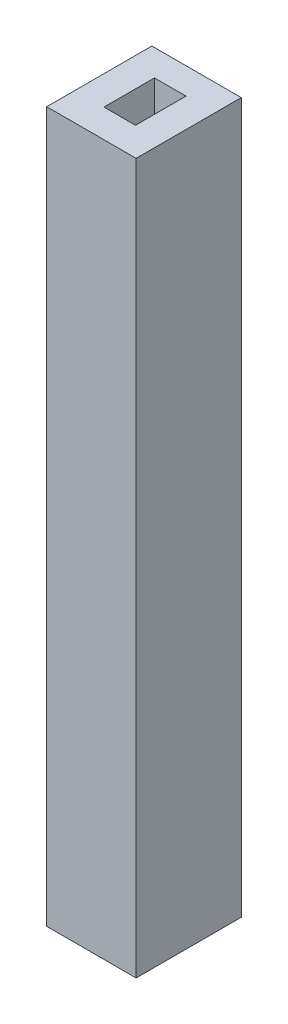
ISO-10303-21;
HEADER;
FILE_DESCRIPTION(('STEP AP214'),'2;1');
FILE_NAME('part.step','',(''),(''),'','','');
FILE_SCHEMA(('AUTOMOTIVE_DESIGN { 1 0 10303 214 1 1 1 1 }'));
ENDSEC;
DATA;
#1=APPLICATION_CONTEXT('core data for automotive mechanical design processes');
#2=APPLICATION_PROTOCOL_DEFINITION('international standard','automotive_design',2000,#1);
#3=PRODUCT_CONTEXT('',#1,'mechanical');
#4=PRODUCT('Part','Part','',(#3));
#5=PRODUCT_RELATED_PRODUCT_CATEGORY('part','',(#4));
#6=PRODUCT_DEFINITION_FORMATION('','',#4);
#7=PRODUCT_DEFINITION_CONTEXT('part definition',#1,'design');
#8=PRODUCT_DEFINITION('design','',#6,#7);
#9=PRODUCT_DEFINITION_SHAPE('','',#8);
#10=(LENGTH_UNIT() NAMED_UNIT(*) SI_UNIT(.MILLI.,.METRE.));
#11=(NAMED_UNIT(*) PLANE_ANGLE_UNIT() SI_UNIT($,.RADIAN.));
#12=(NAMED_UNIT(*) SI_UNIT($,.STERADIAN.) SOLID_ANGLE_UNIT());
#13=UNCERTAINTY_MEASURE_WITH_UNIT(LENGTH_MEASURE(1.E-05),#10,'distance_accuracy_value','');
#14=(GEOMETRIC_REPRESENTATION_CONTEXT(3) GLOBAL_UNCERTAINTY_ASSIGNED_CONTEXT((#13)) GLOBAL_UNIT_ASSIGNED_CONTEXT((#10,
#11,#12)) REPRESENTATION_CONTEXT('',''));
#15=CARTESIAN_POINT('',(0.,0.,0.));
#16=DIRECTION('',(0.,0.,1.));
#17=DIRECTION('',(1.,0.,0.));
#18=AXIS2_PLACEMENT_3D('',#15,#16,#17);
#19=CARTESIAN_POINT('',(17.,0.,20.));
#20=DIRECTION('',(0.,-1.,0.));
#21=DIRECTION('',(0.,0.,-1.));
#22=AXIS2_PLACEMENT_3D('',#19,#20,#21);
#23=PLANE('',#22);
#24=DIRECTION('',(0.,0.,1.));
#25=VECTOR('',#24,1.);
#26=CARTESIAN_POINT('',(-17.,0.,20.));
#27=LINE('',#26,#25);
#28=CARTESIAN_POINT('',(-17.,0.,-20.));
#29=VERTEX_POINT('',#28);
#30=CARTESIAN_POINT('',(-17.,0.,20.));
#31=VERTEX_POINT('',#30);
#32=EDGE_CURVE('E153',#29,#31,#27,.T.);
#33=ORIENTED_EDGE('',*,*,#32,.T.);
#34=DIRECTION('',(-1.,0.,0.));
#35=VECTOR('',#34,1.);
#36=CARTESIAN_POINT('',(17.,0.,20.));
#37=LINE('',#36,#35);
#38=CARTESIAN_POINT('',(17.,0.,20.));
#39=VERTEX_POINT('',#38);
#40=EDGE_CURVE('E40',#39,#31,#37,.T.);
#41=ORIENTED_EDGE('',*,*,#40,.F.);
#42=DIRECTION('',(0.,0.,1.));
#43=VECTOR('',#42,1.);
#44=CARTESIAN_POINT('',(17.,0.,20.));
#45=LINE('',#44,#43);
#46=CARTESIAN_POINT('',(17.,0.,-20.));
#47=VERTEX_POINT('',#46);
#48=EDGE_CURVE('E84',#47,#39,#45,.T.);
#49=ORIENTED_EDGE('',*,*,#48,.F.);
#50=DIRECTION('',(-1.,0.,0.));
#51=VECTOR('',#50,1.);
#52=CARTESIAN_POINT('',(17.,0.,-20.));
#53=LINE('',#52,#51);
#54=EDGE_CURVE('E11',#47,#29,#53,.T.);
#55=ORIENTED_EDGE('',*,*,#54,.T.);
#56=EDGE_LOOP('',(#33,#41,#49,#55));
#57=FACE_BOUND('',#56,.T.);
#58=DIRECTION('',(0.,0.,1.));
#59=VECTOR('',#58,1.);
#60=CARTESIAN_POINT('',(-6.,0.,-9.9791521190625));
#61=LINE('',#60,#59);
#62=CARTESIAN_POINT('',(-6.,0.,-9.9791521190625));
#63=VERTEX_POINT('',#62);
#64=CARTESIAN_POINT('',(-6.,0.,9.23131373330799));
#65=VERTEX_POINT('',#64);
#66=EDGE_CURVE('E123',#63,#65,#61,.T.);
#67=ORIENTED_EDGE('',*,*,#66,.F.);
#68=DIRECTION('',(1.,0.,0.));
#69=VECTOR('',#68,1.);
#70=CARTESIAN_POINT('',(-6.,0.,-9.9791521190625));
#71=LINE('',#70,#69);
#72=CARTESIAN_POINT('',(6.,0.,-9.9791521190625));
#73=VERTEX_POINT('',#72);
#74=EDGE_CURVE('E154',#63,#73,#71,.T.);
#75=ORIENTED_EDGE('',*,*,#74,.T.);
#76=DIRECTION('',(0.,0.,1.));
#77=VECTOR('',#76,1.);
#78=CARTESIAN_POINT('',(6.,0.,-9.9791521190625));
#79=LINE('',#78,#77);
#80=CARTESIAN_POINT('',(6.,0.,9.23131373330799));
#81=VERTEX_POINT('',#80);
#82=EDGE_CURVE('E135',#73,#81,#79,.T.);
#83=ORIENTED_EDGE('',*,*,#82,.T.);
#84=DIRECTION('',(1.,0.,0.));
#85=VECTOR('',#84,1.);
#86=CARTESIAN_POINT('',(-6.,0.,9.23131373330799));
#87=LINE('',#86,#85);
#88=EDGE_CURVE('E116',#65,#81,#87,.T.);
#89=ORIENTED_EDGE('',*,*,#88,.F.);
#90=EDGE_LOOP('',(#67,#75,#83,#89));
#91=FACE_BOUND('',#90,.T.);
#92=ADVANCED_FACE('F32',(#57,#91),#23,.F.);
#93=CARTESIAN_POINT('',(17.,-270.,-20.));
#94=DIRECTION('',(0.,0.,1.));
#95=DIRECTION('',(0.,-1.,0.));
#96=AXIS2_PLACEMENT_3D('',#93,#94,#95);
#97=PLANE('',#96);
#98=DIRECTION('',(0.,1.,0.));
#99=VECTOR('',#98,1.);
#100=CARTESIAN_POINT('',(-17.,-270.,-20.));
#101=LINE('',#100,#99);
#102=CARTESIAN_POINT('',(-17.,-270.,-20.));
#103=VERTEX_POINT('',#102);
#104=EDGE_CURVE('E150',#103,#29,#101,.T.);
#105=ORIENTED_EDGE('',*,*,#104,.T.);
#106=ORIENTED_EDGE('',*,*,#54,.F.);
#107=DIRECTION('',(0.,1.,0.));
#108=VECTOR('',#107,1.);
#109=CARTESIAN_POINT('',(17.,-270.,-20.));
#110=LINE('',#109,#108);
#111=CARTESIAN_POINT('',(17.,-270.,-20.));
#112=VERTEX_POINT('',#111);
#113=EDGE_CURVE('E143',#112,#47,#110,.T.);
#114=ORIENTED_EDGE('',*,*,#113,.F.);
#115=DIRECTION('',(-1.,0.,0.));
#116=VECTOR('',#115,1.);
#117=CARTESIAN_POINT('',(17.,-270.,-20.));
#118=LINE('',#117,#116);
#119=EDGE_CURVE('E149',#112,#103,#118,.T.);
#120=ORIENTED_EDGE('',*,*,#119,.T.);
#121=EDGE_LOOP('',(#105,#106,#114,#120));
#122=FACE_BOUND('',#121,.T.);
#123=ADVANCED_FACE('F34',(#122),#97,.F.);
#124=CARTESIAN_POINT('',(17.,-270.,20.));
#125=DIRECTION('',(0.,0.,-1.));
#126=DIRECTION('',(0.,1.,0.));
#127=AXIS2_PLACEMENT_3D('',#124,#125,#126);
#128=PLANE('',#127);
#129=DIRECTION('',(0.,-1.,0.));
#130=VECTOR('',#129,1.);
#131=CARTESIAN_POINT('',(-17.,-270.,20.));
#132=LINE('',#131,#130);
#133=CARTESIAN_POINT('',(-17.,-270.,20.));
#134=VERTEX_POINT('',#133);
#135=EDGE_CURVE('E156',#31,#134,#132,.T.);
#136=ORIENTED_EDGE('',*,*,#135,.T.);
#137=DIRECTION('',(-1.,0.,0.));
#138=VECTOR('',#137,1.);
#139=CARTESIAN_POINT('',(17.,-270.,20.));
#140=LINE('',#139,#138);
#141=CARTESIAN_POINT('',(17.,-270.,20.));
#142=VERTEX_POINT('',#141);
#143=EDGE_CURVE('E160',#142,#134,#140,.T.);
#144=ORIENTED_EDGE('',*,*,#143,.F.);
#145=DIRECTION('',(0.,-1.,0.));
#146=VECTOR('',#145,1.);
#147=CARTESIAN_POINT('',(17.,-270.,20.));
#148=LINE('',#147,#146);
#149=EDGE_CURVE('E146',#39,#142,#148,.T.);
#150=ORIENTED_EDGE('',*,*,#149,.F.);
#151=ORIENTED_EDGE('',*,*,#40,.T.);
#152=EDGE_LOOP('',(#136,#144,#150,#151));
#153=FACE_BOUND('',#152,.T.);
#154=ADVANCED_FACE('F165',(#153),#128,.F.);
#155=CARTESIAN_POINT('',(17.,-270.,20.));
#156=DIRECTION('',(0.,1.,0.));
#157=DIRECTION('',(0.,0.,1.));
#158=AXIS2_PLACEMENT_3D('',#155,#156,#157);
#159=PLANE('',#158);
#160=DIRECTION('',(0.,0.,-1.));
#161=VECTOR('',#160,1.);
#162=CARTESIAN_POINT('',(-17.,-270.,20.));
#163=LINE('',#162,#161);
#164=EDGE_CURVE('E77',#134,#103,#163,.T.);
#165=ORIENTED_EDGE('',*,*,#164,.T.);
#166=ORIENTED_EDGE('',*,*,#119,.F.);
#167=DIRECTION('',(0.,0.,-1.));
#168=VECTOR('',#167,1.);
#169=CARTESIAN_POINT('',(17.,-270.,20.));
#170=LINE('',#169,#168);
#171=EDGE_CURVE('E56',#142,#112,#170,.T.);
#172=ORIENTED_EDGE('',*,*,#171,.F.);
#173=ORIENTED_EDGE('',*,*,#143,.T.);
#174=EDGE_LOOP('',(#165,#166,#172,#173));
#175=FACE_BOUND('',#174,.T.);
#176=ADVANCED_FACE('F173',(#175),#159,.F.);
#177=CARTESIAN_POINT('',(17.,0.,0.));
#178=DIRECTION('',(-1.,0.,0.));
#179=DIRECTION('',(0.,0.,1.));
#180=AXIS2_PLACEMENT_3D('',#177,#178,#179);
#181=PLANE('',#180);
#182=ORIENTED_EDGE('',*,*,#113,.T.);
#183=ORIENTED_EDGE('',*,*,#48,.T.);
#184=ORIENTED_EDGE('',*,*,#149,.T.);
#185=ORIENTED_EDGE('',*,*,#171,.T.);
#186=EDGE_LOOP('',(#182,#183,#184,#185));
#187=FACE_BOUND('',#186,.T.);
#188=ADVANCED_FACE('F175',(#187),#181,.F.);
#189=CARTESIAN_POINT('',(-17.,0.,0.));
#190=DIRECTION('',(-1.,0.,0.));
#191=DIRECTION('',(0.,0.,1.));
#192=AXIS2_PLACEMENT_3D('',#189,#190,#191);
#193=PLANE('',#192);
#194=ORIENTED_EDGE('',*,*,#104,.F.);
#195=ORIENTED_EDGE('',*,*,#164,.F.);
#196=ORIENTED_EDGE('',*,*,#135,.F.);
#197=ORIENTED_EDGE('',*,*,#32,.F.);
#198=EDGE_LOOP('',(#194,#195,#196,#197));
#199=FACE_BOUND('',#198,.T.);
#200=ADVANCED_FACE('F169',(#199),#193,.T.);
#201=CARTESIAN_POINT('',(-6.,-120.,-9.9791521190625));
#202=DIRECTION('',(0.,0.,-1.));
#203=DIRECTION('',(-1.,0.,0.));
#204=AXIS2_PLACEMENT_3D('',#201,#202,#203);
#205=PLANE('',#204);
#206=DIRECTION('',(0.,1.,0.));
#207=VECTOR('',#206,1.);
#208=CARTESIAN_POINT('',(6.,-120.,-9.9791521190625));
#209=LINE('',#208,#207);
#210=CARTESIAN_POINT('',(6.,-120.,-9.9791521190625));
#211=VERTEX_POINT('',#210);
#212=EDGE_CURVE('E133',#211,#73,#209,.T.);
#213=ORIENTED_EDGE('',*,*,#212,.T.);
#214=ORIENTED_EDGE('',*,*,#74,.F.);
#215=DIRECTION('',(0.,1.,0.));
#216=VECTOR('',#215,1.);
#217=CARTESIAN_POINT('',(-6.,-120.,-9.9791521190625));
#218=LINE('',#217,#216);
#219=CARTESIAN_POINT('',(-6.,-120.,-9.9791521190625));
#220=VERTEX_POINT('',#219);
#221=EDGE_CURVE('E130',#220,#63,#218,.T.);
#222=ORIENTED_EDGE('',*,*,#221,.F.);
#223=DIRECTION('',(1.,0.,0.));
#224=VECTOR('',#223,1.);
#225=CARTESIAN_POINT('',(-6.,-120.,-9.9791521190625));
#226=LINE('',#225,#224);
#227=EDGE_CURVE('E278',#220,#211,#226,.T.);
#228=ORIENTED_EDGE('',*,*,#227,.T.);
#229=EDGE_LOOP('',(#213,#214,#222,#228));
#230=FACE_BOUND('',#229,.T.);
#231=ADVANCED_FACE('F212',(#230),#205,.F.);
#232=CARTESIAN_POINT('',(-6.,-120.,5.0208478809375));
#233=DIRECTION('',(0.,-1.,0.));
#234=DIRECTION('',(0.,0.,-1.));
#235=AXIS2_PLACEMENT_3D('',#232,#233,#234);
#236=PLANE('',#235);
#237=DIRECTION('',(0.,0.,-1.));
#238=VECTOR('',#237,1.);
#239=CARTESIAN_POINT('',(6.,-120.,5.0208478809375));
#240=LINE('',#239,#238);
#241=CARTESIAN_POINT('',(6.,-120.,5.0208478809375));
#242=VERTEX_POINT('',#241);
#243=EDGE_CURVE('E280',#242,#211,#240,.T.);
#244=ORIENTED_EDGE('',*,*,#243,.T.);
#245=ORIENTED_EDGE('',*,*,#227,.F.);
#246=DIRECTION('',(0.,0.,-1.));
#247=VECTOR('',#246,1.);
#248=CARTESIAN_POINT('',(-6.,-120.,5.0208478809375));
#249=LINE('',#248,#247);
#250=CARTESIAN_POINT('',(-6.,-120.,5.0208478809375));
#251=VERTEX_POINT('',#250);
#252=EDGE_CURVE('E139',#251,#220,#249,.T.);
#253=ORIENTED_EDGE('',*,*,#252,.F.);
#254=DIRECTION('',(1.,0.,0.));
#255=VECTOR('',#254,1.);
#256=CARTESIAN_POINT('',(-6.,-120.,5.0208478809375));
#257=LINE('',#256,#255);
#258=EDGE_CURVE('E137',#251,#242,#257,.T.);
#259=ORIENTED_EDGE('',*,*,#258,.T.);
#260=EDGE_LOOP('',(#244,#245,#253,#259));
#261=FACE_BOUND('',#260,.T.);
#262=ADVANCED_FACE('F225',(#261),#236,.F.);
#263=CARTESIAN_POINT('',(-6.,-13.5183917500885,9.23131373330799));
#264=DIRECTION('',(0.,-0.0395108427142013,0.99921914178423));
#265=DIRECTION('',(0.,-0.99921914178423,-0.0395108427142013));
#266=AXIS2_PLACEMENT_3D('',#263,#264,#265);
#267=PLANE('',#266);
#268=DIRECTION('',(0.,-0.99921914178423,-0.0395108427142013));
#269=VECTOR('',#268,1.);
#270=CARTESIAN_POINT('',(6.,-13.5183917500885,9.23131373330799));
#271=LINE('',#270,#269);
#272=CARTESIAN_POINT('',(6.,-13.5183917500885,9.23131373330799));
#273=VERTEX_POINT('',#272);
#274=EDGE_CURVE('E287',#273,#242,#271,.T.);
#275=ORIENTED_EDGE('',*,*,#274,.T.);
#276=ORIENTED_EDGE('',*,*,#258,.F.);
#277=DIRECTION('',(0.,-0.99921914178423,-0.0395108427142013));
#278=VECTOR('',#277,1.);
#279=CARTESIAN_POINT('',(-6.,-13.5183917500885,9.23131373330799));
#280=LINE('',#279,#278);
#281=CARTESIAN_POINT('',(-6.,-13.5183917500885,9.23131373330799));
#282=VERTEX_POINT('',#281);
#283=EDGE_CURVE('E122',#282,#251,#280,.T.);
#284=ORIENTED_EDGE('',*,*,#283,.F.);
#285=DIRECTION('',(1.,0.,0.));
#286=VECTOR('',#285,1.);
#287=CARTESIAN_POINT('',(-6.,-13.5183917500885,9.23131373330799));
#288=LINE('',#287,#286);
#289=EDGE_CURVE('E118',#282,#273,#288,.T.);
#290=ORIENTED_EDGE('',*,*,#289,.T.);
#291=EDGE_LOOP('',(#275,#276,#284,#290));
#292=FACE_BOUND('',#291,.T.);
#293=ADVANCED_FACE('F235',(#292),#267,.F.);
#294=CARTESIAN_POINT('',(-6.,0.,9.23131373330799));
#295=DIRECTION('',(0.,0.,1.));
#296=DIRECTION('',(1.,0.,0.));
#297=AXIS2_PLACEMENT_3D('',#294,#295,#296);
#298=PLANE('',#297);
#299=DIRECTION('',(0.,-1.,0.));
#300=VECTOR('',#299,1.);
#301=CARTESIAN_POINT('',(6.,0.,9.23131373330799));
#302=LINE('',#301,#300);
#303=EDGE_CURVE('E47',#81,#273,#302,.T.);
#304=ORIENTED_EDGE('',*,*,#303,.T.);
#305=ORIENTED_EDGE('',*,*,#289,.F.);
#306=DIRECTION('',(0.,-1.,0.));
#307=VECTOR('',#306,1.);
#308=CARTESIAN_POINT('',(-6.,0.,9.23131373330799));
#309=LINE('',#308,#307);
#310=EDGE_CURVE('E112',#65,#282,#309,.T.);
#311=ORIENTED_EDGE('',*,*,#310,.F.);
#312=ORIENTED_EDGE('',*,*,#88,.T.);
#313=EDGE_LOOP('',(#304,#305,#311,#312));
#314=FACE_BOUND('',#313,.T.);
#315=ADVANCED_FACE('F114',(#314),#298,.F.);
#316=CARTESIAN_POINT('',(-6.,0.,0.));
#317=DIRECTION('',(1.,0.,0.));
#318=DIRECTION('',(0.,0.,-1.));
#319=AXIS2_PLACEMENT_3D('',#316,#317,#318);
#320=PLANE('',#319);
#321=ORIENTED_EDGE('',*,*,#66,.T.);
#322=ORIENTED_EDGE('',*,*,#310,.T.);
#323=ORIENTED_EDGE('',*,*,#283,.T.);
#324=ORIENTED_EDGE('',*,*,#252,.T.);
#325=ORIENTED_EDGE('',*,*,#221,.T.);
#326=EDGE_LOOP('',(#321,#322,#323,#324,#325));
#327=FACE_BOUND('',#326,.T.);
#328=ADVANCED_FACE('F127',(#327),#320,.T.);
#329=CARTESIAN_POINT('',(6.,0.,0.));
#330=DIRECTION('',(1.,0.,0.));
#331=DIRECTION('',(0.,0.,-1.));
#332=AXIS2_PLACEMENT_3D('',#329,#330,#331);
#333=PLANE('',#332);
#334=ORIENTED_EDGE('',*,*,#82,.F.);
#335=ORIENTED_EDGE('',*,*,#212,.F.);
#336=ORIENTED_EDGE('',*,*,#243,.F.);
#337=ORIENTED_EDGE('',*,*,#274,.F.);
#338=ORIENTED_EDGE('',*,*,#303,.F.);
#339=EDGE_LOOP('',(#334,#335,#336,#337,#338));
#340=FACE_BOUND('',#339,.T.);
#341=ADVANCED_FACE('F262',(#340),#333,.F.);
#342=CLOSED_SHELL('',(#92,#123,#154,#176,#188,#200,#231,#262,#293,#315,#328,#341));
#343=MANIFOLD_SOLID_BREP('B2',#342);
#344=ADVANCED_BREP_SHAPE_REPRESENTATION('',(#18,#343),#14);
#345=SHAPE_DEFINITION_REPRESENTATION(#9,#344);
ENDSEC;
END-ISO-10303-21;
